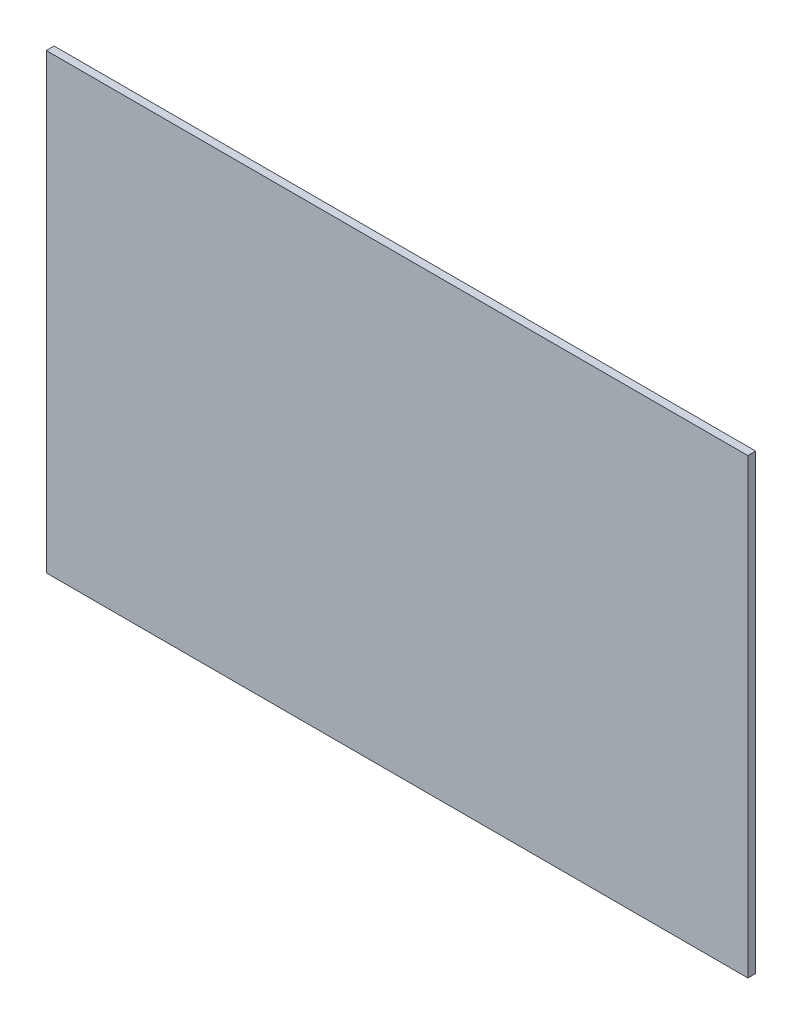
ISO-10303-21;
HEADER;
FILE_DESCRIPTION(('STEP AP214'),'2;1');
FILE_NAME('part.step','',(''),(''),'','','');
FILE_SCHEMA(('AUTOMOTIVE_DESIGN { 1 0 10303 214 1 1 1 1 }'));
ENDSEC;
DATA;
#1=APPLICATION_CONTEXT('core data for automotive mechanical design processes');
#2=APPLICATION_PROTOCOL_DEFINITION('international standard','automotive_design',2000,#1);
#3=PRODUCT_CONTEXT('',#1,'mechanical');
#4=PRODUCT('Part','Part','',(#3));
#5=PRODUCT_RELATED_PRODUCT_CATEGORY('part','',(#4));
#6=PRODUCT_DEFINITION_FORMATION('','',#4);
#7=PRODUCT_DEFINITION_CONTEXT('part definition',#1,'design');
#8=PRODUCT_DEFINITION('design','',#6,#7);
#9=PRODUCT_DEFINITION_SHAPE('','',#8);
#10=(LENGTH_UNIT() NAMED_UNIT(*) SI_UNIT(.MILLI.,.METRE.));
#11=(NAMED_UNIT(*) PLANE_ANGLE_UNIT() SI_UNIT($,.RADIAN.));
#12=(NAMED_UNIT(*) SI_UNIT($,.STERADIAN.) SOLID_ANGLE_UNIT());
#13=UNCERTAINTY_MEASURE_WITH_UNIT(LENGTH_MEASURE(1.E-05),#10,'distance_accuracy_value','');
#14=(GEOMETRIC_REPRESENTATION_CONTEXT(3) GLOBAL_UNCERTAINTY_ASSIGNED_CONTEXT((#13)) GLOBAL_UNIT_ASSIGNED_CONTEXT((#10,
#11,#12)) REPRESENTATION_CONTEXT('',''));
#15=CARTESIAN_POINT('',(0.,0.,0.));
#16=DIRECTION('',(0.,0.,1.));
#17=DIRECTION('',(1.,0.,0.));
#18=AXIS2_PLACEMENT_3D('',#15,#16,#17);
#19=CARTESIAN_POINT('',(-367.472703646106,191.929785592439,6.));
#20=DIRECTION('',(1.,0.,0.));
#21=DIRECTION('',(0.,0.,-1.));
#22=AXIS2_PLACEMENT_3D('',#19,#20,#21);
#23=PLANE('',#22);
#24=DIRECTION('',(0.,-1.,0.));
#25=VECTOR('',#24,1.);
#26=CARTESIAN_POINT('',(-367.472703646106,191.929785592439,0.));
#27=LINE('',#26,#25);
#28=CARTESIAN_POINT('',(-367.472703646106,191.929785592439,0.));
#29=VERTEX_POINT('',#28);
#30=CARTESIAN_POINT('',(-367.472703646106,-154.970214407513,0.));
#31=VERTEX_POINT('',#30);
#32=EDGE_CURVE('E107',#29,#31,#27,.T.);
#33=ORIENTED_EDGE('',*,*,#32,.T.);
#34=DIRECTION('',(0.,0.,-1.));
#35=VECTOR('',#34,1.);
#36=CARTESIAN_POINT('',(-367.472703646106,-154.970214407513,6.));
#37=LINE('',#36,#35);
#38=CARTESIAN_POINT('',(-367.472703646106,-154.970214407513,6.));
#39=VERTEX_POINT('',#38);
#40=EDGE_CURVE('E11',#39,#31,#37,.T.);
#41=ORIENTED_EDGE('',*,*,#40,.F.);
#42=DIRECTION('',(0.,-1.,0.));
#43=VECTOR('',#42,1.);
#44=CARTESIAN_POINT('',(-367.472703646106,191.929785592439,6.));
#45=LINE('',#44,#43);
#46=CARTESIAN_POINT('',(-367.472703646106,191.929785592439,6.));
#47=VERTEX_POINT('',#46);
#48=EDGE_CURVE('E91',#47,#39,#45,.T.);
#49=ORIENTED_EDGE('',*,*,#48,.F.);
#50=DIRECTION('',(0.,0.,-1.));
#51=VECTOR('',#50,1.);
#52=CARTESIAN_POINT('',(-367.472703646106,191.929785592439,6.));
#53=LINE('',#52,#51);
#54=EDGE_CURVE('E103',#47,#29,#53,.T.);
#55=ORIENTED_EDGE('',*,*,#54,.T.);
#56=EDGE_LOOP('',(#33,#41,#49,#55));
#57=FACE_BOUND('',#56,.T.);
#58=ADVANCED_FACE('F39',(#57),#23,.F.);
#59=CARTESIAN_POINT('',(-367.472703646106,-154.970214407513,6.));
#60=DIRECTION('',(0.,1.,0.));
#61=DIRECTION('',(0.,0.,1.));
#62=AXIS2_PLACEMENT_3D('',#59,#60,#61);
#63=PLANE('',#62);
#64=DIRECTION('',(1.,0.,0.));
#65=VECTOR('',#64,1.);
#66=CARTESIAN_POINT('',(-367.472703646106,-154.970214407513,0.));
#67=LINE('',#66,#65);
#68=CARTESIAN_POINT('',(170.527296353002,-154.970214407513,0.));
#69=VERTEX_POINT('',#68);
#70=EDGE_CURVE('E96',#31,#69,#67,.T.);
#71=ORIENTED_EDGE('',*,*,#70,.T.);
#72=DIRECTION('',(0.,0.,-1.));
#73=VECTOR('',#72,1.);
#74=CARTESIAN_POINT('',(170.527296353002,-154.970214407513,6.));
#75=LINE('',#74,#73);
#76=CARTESIAN_POINT('',(170.527296353002,-154.970214407513,6.));
#77=VERTEX_POINT('',#76);
#78=EDGE_CURVE('E48',#77,#69,#75,.T.);
#79=ORIENTED_EDGE('',*,*,#78,.F.);
#80=DIRECTION('',(1.,0.,0.));
#81=VECTOR('',#80,1.);
#82=CARTESIAN_POINT('',(-367.472703646106,-154.970214407513,6.));
#83=LINE('',#82,#81);
#84=EDGE_CURVE('E86',#39,#77,#83,.T.);
#85=ORIENTED_EDGE('',*,*,#84,.F.);
#86=ORIENTED_EDGE('',*,*,#40,.T.);
#87=EDGE_LOOP('',(#71,#79,#85,#86));
#88=FACE_BOUND('',#87,.T.);
#89=ADVANCED_FACE('F95',(#88),#63,.F.);
#90=CARTESIAN_POINT('',(170.527296353002,191.929785592439,6.));
#91=DIRECTION('',(-1.,0.,0.));
#92=DIRECTION('',(0.,0.,1.));
#93=AXIS2_PLACEMENT_3D('',#90,#91,#92);
#94=PLANE('',#93);
#95=DIRECTION('',(0.,1.,0.));
#96=VECTOR('',#95,1.);
#97=CARTESIAN_POINT('',(170.527296353002,191.929785592439,0.));
#98=LINE('',#97,#96);
#99=CARTESIAN_POINT('',(170.527296353002,191.929785592439,0.));
#100=VERTEX_POINT('',#99);
#101=EDGE_CURVE('E73',#69,#100,#98,.T.);
#102=ORIENTED_EDGE('',*,*,#101,.T.);
#103=DIRECTION('',(0.,0.,-1.));
#104=VECTOR('',#103,1.);
#105=CARTESIAN_POINT('',(170.527296353002,191.929785592439,6.));
#106=LINE('',#105,#104);
#107=CARTESIAN_POINT('',(170.527296353002,191.929785592439,6.));
#108=VERTEX_POINT('',#107);
#109=EDGE_CURVE('E98',#108,#100,#106,.T.);
#110=ORIENTED_EDGE('',*,*,#109,.F.);
#111=DIRECTION('',(0.,1.,0.));
#112=VECTOR('',#111,1.);
#113=CARTESIAN_POINT('',(170.527296353002,191.929785592439,6.));
#114=LINE('',#113,#112);
#115=EDGE_CURVE('E89',#77,#108,#114,.T.);
#116=ORIENTED_EDGE('',*,*,#115,.F.);
#117=ORIENTED_EDGE('',*,*,#78,.T.);
#118=EDGE_LOOP('',(#102,#110,#116,#117));
#119=FACE_BOUND('',#118,.T.);
#120=ADVANCED_FACE('F99',(#119),#94,.F.);
#121=CARTESIAN_POINT('',(-367.472703646106,191.929785592439,6.));
#122=DIRECTION('',(0.,-1.,0.));
#123=DIRECTION('',(0.,0.,-1.));
#124=AXIS2_PLACEMENT_3D('',#121,#122,#123);
#125=PLANE('',#124);
#126=DIRECTION('',(-1.,0.,0.));
#127=VECTOR('',#126,1.);
#128=CARTESIAN_POINT('',(-367.472703646106,191.929785592439,0.));
#129=LINE('',#128,#127);
#130=EDGE_CURVE('E79',#100,#29,#129,.T.);
#131=ORIENTED_EDGE('',*,*,#130,.T.);
#132=ORIENTED_EDGE('',*,*,#54,.F.);
#133=DIRECTION('',(-1.,0.,0.));
#134=VECTOR('',#133,1.);
#135=CARTESIAN_POINT('',(-367.472703646106,191.929785592439,6.));
#136=LINE('',#135,#134);
#137=EDGE_CURVE('E56',#108,#47,#136,.T.);
#138=ORIENTED_EDGE('',*,*,#137,.F.);
#139=ORIENTED_EDGE('',*,*,#109,.T.);
#140=EDGE_LOOP('',(#131,#132,#138,#139));
#141=FACE_BOUND('',#140,.T.);
#142=ADVANCED_FACE('F120',(#141),#125,.F.);
#143=CARTESIAN_POINT('',(0.,0.,6.));
#144=DIRECTION('',(0.,0.,1.));
#145=DIRECTION('',(1.,0.,0.));
#146=AXIS2_PLACEMENT_3D('',#143,#144,#145);
#147=PLANE('',#146);
#148=ORIENTED_EDGE('',*,*,#48,.T.);
#149=ORIENTED_EDGE('',*,*,#84,.T.);
#150=ORIENTED_EDGE('',*,*,#115,.T.);
#151=ORIENTED_EDGE('',*,*,#137,.T.);
#152=EDGE_LOOP('',(#148,#149,#150,#151));
#153=FACE_BOUND('',#152,.T.);
#154=ADVANCED_FACE('F87',(#153),#147,.T.);
#155=CARTESIAN_POINT('',(0.,0.,0.));
#156=DIRECTION('',(0.,0.,1.));
#157=DIRECTION('',(1.,0.,0.));
#158=AXIS2_PLACEMENT_3D('',#155,#156,#157);
#159=PLANE('',#158);
#160=ORIENTED_EDGE('',*,*,#32,.F.);
#161=ORIENTED_EDGE('',*,*,#130,.F.);
#162=ORIENTED_EDGE('',*,*,#101,.F.);
#163=ORIENTED_EDGE('',*,*,#70,.F.);
#164=EDGE_LOOP('',(#160,#161,#162,#163));
#165=FACE_BOUND('',#164,.T.);
#166=ADVANCED_FACE('F123',(#165),#159,.F.);
#167=CLOSED_SHELL('',(#58,#89,#120,#142,#154,#166));
#168=MANIFOLD_SOLID_BREP('B2',#167);
#169=ADVANCED_BREP_SHAPE_REPRESENTATION('',(#18,#168),#14);
#170=SHAPE_DEFINITION_REPRESENTATION(#9,#169);
ENDSEC;
END-ISO-10303-21;
